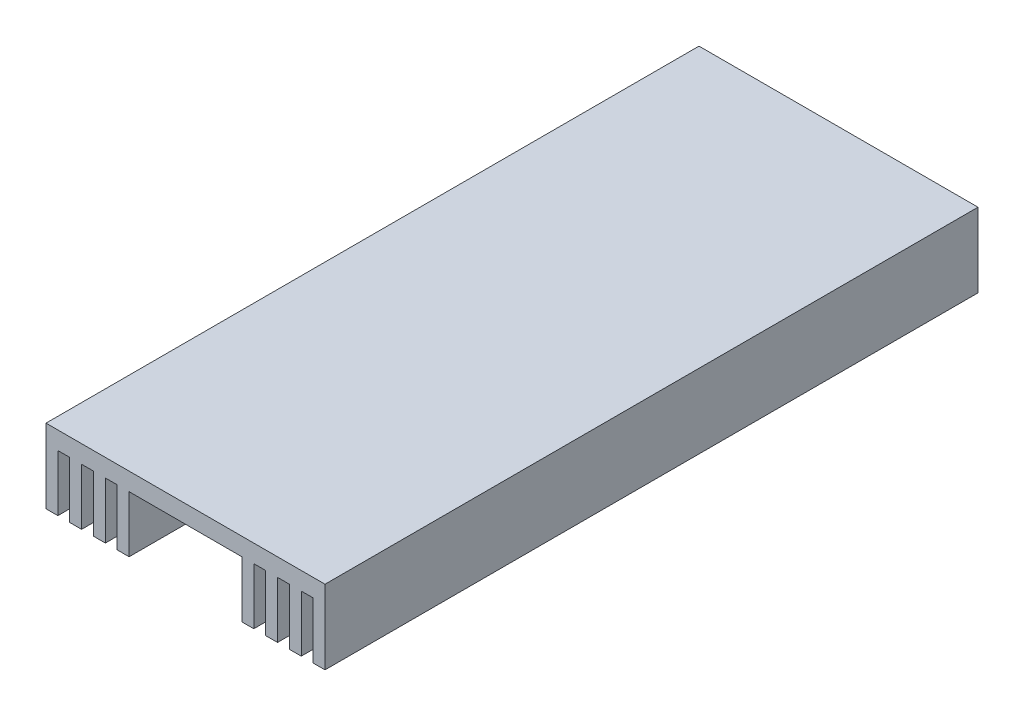
ISO-10303-21;
HEADER;
FILE_DESCRIPTION(('STEP AP214'),'2;1');
FILE_NAME('part.step','',(''),(''),'','','');
FILE_SCHEMA(('AUTOMOTIVE_DESIGN { 1 0 10303 214 1 1 1 1 }'));
ENDSEC;
DATA;
#1=APPLICATION_CONTEXT('core data for automotive mechanical design processes');
#2=APPLICATION_PROTOCOL_DEFINITION('international standard','automotive_design',2000,#1);
#3=PRODUCT_CONTEXT('',#1,'mechanical');
#4=PRODUCT('Part','Part','',(#3));
#5=PRODUCT_RELATED_PRODUCT_CATEGORY('part','',(#4));
#6=PRODUCT_DEFINITION_FORMATION('','',#4);
#7=PRODUCT_DEFINITION_CONTEXT('part definition',#1,'design');
#8=PRODUCT_DEFINITION('design','',#6,#7);
#9=PRODUCT_DEFINITION_SHAPE('','',#8);
#10=(LENGTH_UNIT() NAMED_UNIT(*) SI_UNIT(.MILLI.,.METRE.));
#11=(NAMED_UNIT(*) PLANE_ANGLE_UNIT() SI_UNIT($,.RADIAN.));
#12=(NAMED_UNIT(*) SI_UNIT($,.STERADIAN.) SOLID_ANGLE_UNIT());
#13=UNCERTAINTY_MEASURE_WITH_UNIT(LENGTH_MEASURE(1.E-05),#10,'distance_accuracy_value','');
#14=(GEOMETRIC_REPRESENTATION_CONTEXT(3) GLOBAL_UNCERTAINTY_ASSIGNED_CONTEXT((#13)) GLOBAL_UNIT_ASSIGNED_CONTEXT((#10,
#11,#12)) REPRESENTATION_CONTEXT('',''));
#15=CARTESIAN_POINT('',(0.,0.,0.));
#16=DIRECTION('',(0.,0.,1.));
#17=DIRECTION('',(1.,0.,0.));
#18=AXIS2_PLACEMENT_3D('',#15,#16,#17);
#19=CARTESIAN_POINT('',(0.,9.5,110.));
#20=DIRECTION('',(0.,1.,0.));
#21=DIRECTION('',(0.,0.,1.));
#22=AXIS2_PLACEMENT_3D('',#19,#20,#21);
#23=PLANE('',#22);
#24=DIRECTION('',(1.,0.,0.));
#25=VECTOR('',#24,1.);
#26=CARTESIAN_POINT('',(0.,9.5,0.));
#27=LINE('',#26,#25);
#28=CARTESIAN_POINT('',(14.,9.5,0.));
#29=VERTEX_POINT('',#28);
#30=CARTESIAN_POINT('',(33.,9.5,0.));
#31=VERTEX_POINT('',#30);
#32=EDGE_CURVE('E273',#29,#31,#27,.T.);
#33=ORIENTED_EDGE('',*,*,#32,.T.);
#34=DIRECTION('',(0.,0.,-1.));
#35=VECTOR('',#34,1.);
#36=CARTESIAN_POINT('',(33.,9.5,110.));
#37=LINE('',#36,#35);
#38=CARTESIAN_POINT('',(33.,9.5,110.));
#39=VERTEX_POINT('',#38);
#40=EDGE_CURVE('E11',#39,#31,#37,.T.);
#41=ORIENTED_EDGE('',*,*,#40,.F.);
#42=DIRECTION('',(1.,0.,0.));
#43=VECTOR('',#42,1.);
#44=CARTESIAN_POINT('',(0.,9.5,110.));
#45=LINE('',#44,#43);
#46=CARTESIAN_POINT('',(14.,9.5,110.));
#47=VERTEX_POINT('',#46);
#48=EDGE_CURVE('E162',#47,#39,#45,.T.);
#49=ORIENTED_EDGE('',*,*,#48,.F.);
#50=DIRECTION('',(0.,0.,-1.));
#51=VECTOR('',#50,1.);
#52=CARTESIAN_POINT('',(14.,9.5,110.));
#53=LINE('',#52,#51);
#54=EDGE_CURVE('E269',#47,#29,#53,.T.);
#55=ORIENTED_EDGE('',*,*,#54,.T.);
#56=EDGE_LOOP('',(#33,#41,#49,#55));
#57=FACE_BOUND('',#56,.T.);
#58=ADVANCED_FACE('F34',(#57),#23,.F.);
#59=CARTESIAN_POINT('',(33.,0.,110.));
#60=DIRECTION('',(-1.,0.,0.));
#61=DIRECTION('',(0.,-1.,0.));
#62=AXIS2_PLACEMENT_3D('',#59,#60,#61);
#63=PLANE('',#62);
#64=DIRECTION('',(0.,1.,0.));
#65=VECTOR('',#64,1.);
#66=CARTESIAN_POINT('',(33.,0.,0.));
#67=LINE('',#66,#65);
#68=CARTESIAN_POINT('',(33.,0.,0.));
#69=VERTEX_POINT('',#68);
#70=EDGE_CURVE('E276',#69,#31,#67,.T.);
#71=ORIENTED_EDGE('',*,*,#70,.F.);
#72=DIRECTION('',(0.,0.,-1.));
#73=VECTOR('',#72,1.);
#74=CARTESIAN_POINT('',(33.,0.,110.));
#75=LINE('',#74,#73);
#76=CARTESIAN_POINT('',(33.,0.,110.));
#77=VERTEX_POINT('',#76);
#78=EDGE_CURVE('E42',#77,#69,#75,.T.);
#79=ORIENTED_EDGE('',*,*,#78,.F.);
#80=DIRECTION('',(0.,1.,0.));
#81=VECTOR('',#80,1.);
#82=CARTESIAN_POINT('',(33.,0.,110.));
#83=LINE('',#82,#81);
#84=EDGE_CURVE('E438',#77,#39,#83,.T.);
#85=ORIENTED_EDGE('',*,*,#84,.T.);
#86=ORIENTED_EDGE('',*,*,#40,.T.);
#87=EDGE_LOOP('',(#71,#79,#85,#86));
#88=FACE_BOUND('',#87,.T.);
#89=ADVANCED_FACE('F425',(#88),#63,.T.);
#90=CARTESIAN_POINT('',(0.,0.,110.));
#91=DIRECTION('',(0.,-1.,0.));
#92=DIRECTION('',(0.,0.,-1.));
#93=AXIS2_PLACEMENT_3D('',#90,#91,#92);
#94=PLANE('',#93);
#95=DIRECTION('',(-1.,0.,0.));
#96=VECTOR('',#95,1.);
#97=CARTESIAN_POINT('',(0.,0.,0.));
#98=LINE('',#97,#96);
#99=CARTESIAN_POINT('',(35.,0.,0.));
#100=VERTEX_POINT('',#99);
#101=EDGE_CURVE('E279',#100,#69,#98,.T.);
#102=ORIENTED_EDGE('',*,*,#101,.F.);
#103=DIRECTION('',(0.,0.,-1.));
#104=VECTOR('',#103,1.);
#105=CARTESIAN_POINT('',(35.,0.,110.));
#106=LINE('',#105,#104);
#107=CARTESIAN_POINT('',(35.,0.,110.));
#108=VERTEX_POINT('',#107);
#109=EDGE_CURVE('E415',#108,#100,#106,.T.);
#110=ORIENTED_EDGE('',*,*,#109,.F.);
#111=DIRECTION('',(-1.,0.,0.));
#112=VECTOR('',#111,1.);
#113=CARTESIAN_POINT('',(0.,0.,110.));
#114=LINE('',#113,#112);
#115=EDGE_CURVE('E422',#108,#77,#114,.T.);
#116=ORIENTED_EDGE('',*,*,#115,.T.);
#117=ORIENTED_EDGE('',*,*,#78,.T.);
#118=EDGE_LOOP('',(#102,#110,#116,#117));
#119=FACE_BOUND('',#118,.T.);
#120=ADVANCED_FACE('F420',(#119),#94,.T.);
#121=CARTESIAN_POINT('',(35.,0.,110.));
#122=DIRECTION('',(1.,0.,0.));
#123=DIRECTION('',(0.,0.,-1.));
#124=AXIS2_PLACEMENT_3D('',#121,#122,#123);
#125=PLANE('',#124);
#126=DIRECTION('',(0.,-1.,0.));
#127=VECTOR('',#126,1.);
#128=CARTESIAN_POINT('',(35.,0.,0.));
#129=LINE('',#128,#127);
#130=CARTESIAN_POINT('',(35.,9.5,0.));
#131=VERTEX_POINT('',#130);
#132=EDGE_CURVE('E282',#131,#100,#129,.T.);
#133=ORIENTED_EDGE('',*,*,#132,.F.);
#134=DIRECTION('',(0.,0.,-1.));
#135=VECTOR('',#134,1.);
#136=CARTESIAN_POINT('',(35.,9.5,110.));
#137=LINE('',#136,#135);
#138=CARTESIAN_POINT('',(35.,9.5,110.));
#139=VERTEX_POINT('',#138);
#140=EDGE_CURVE('E413',#139,#131,#137,.T.);
#141=ORIENTED_EDGE('',*,*,#140,.F.);
#142=DIRECTION('',(0.,-1.,0.));
#143=VECTOR('',#142,1.);
#144=CARTESIAN_POINT('',(35.,0.,110.));
#145=LINE('',#144,#143);
#146=EDGE_CURVE('E435',#139,#108,#145,.T.);
#147=ORIENTED_EDGE('',*,*,#146,.T.);
#148=ORIENTED_EDGE('',*,*,#109,.T.);
#149=EDGE_LOOP('',(#133,#141,#147,#148));
#150=FACE_BOUND('',#149,.T.);
#151=ADVANCED_FACE('F432',(#150),#125,.T.);
#152=CARTESIAN_POINT('',(0.,9.5,110.));
#153=DIRECTION('',(0.,-1.,0.));
#154=DIRECTION('',(0.,0.,-1.));
#155=AXIS2_PLACEMENT_3D('',#152,#153,#154);
#156=PLANE('',#155);
#157=DIRECTION('',(-1.,0.,0.));
#158=VECTOR('',#157,1.);
#159=CARTESIAN_POINT('',(0.,9.5,0.));
#160=LINE('',#159,#158);
#161=CARTESIAN_POINT('',(37.,9.5,0.));
#162=VERTEX_POINT('',#161);
#163=EDGE_CURVE('E285',#162,#131,#160,.T.);
#164=ORIENTED_EDGE('',*,*,#163,.F.);
#165=DIRECTION('',(0.,0.,-1.));
#166=VECTOR('',#165,1.);
#167=CARTESIAN_POINT('',(37.,9.5,110.));
#168=LINE('',#167,#166);
#169=CARTESIAN_POINT('',(37.,9.5,110.));
#170=VERTEX_POINT('',#169);
#171=EDGE_CURVE('E411',#170,#162,#168,.T.);
#172=ORIENTED_EDGE('',*,*,#171,.F.);
#173=DIRECTION('',(-1.,0.,0.));
#174=VECTOR('',#173,1.);
#175=CARTESIAN_POINT('',(0.,9.5,110.));
#176=LINE('',#175,#174);
#177=EDGE_CURVE('E440',#170,#139,#176,.T.);
#178=ORIENTED_EDGE('',*,*,#177,.T.);
#179=ORIENTED_EDGE('',*,*,#140,.T.);
#180=EDGE_LOOP('',(#164,#172,#178,#179));
#181=FACE_BOUND('',#180,.T.);
#182=ADVANCED_FACE('F536',(#181),#156,.T.);
#183=CARTESIAN_POINT('',(37.,0.,110.));
#184=DIRECTION('',(-1.,0.,0.));
#185=DIRECTION('',(0.,0.,1.));
#186=AXIS2_PLACEMENT_3D('',#183,#184,#185);
#187=PLANE('',#186);
#188=DIRECTION('',(0.,1.,0.));
#189=VECTOR('',#188,1.);
#190=CARTESIAN_POINT('',(37.,0.,0.));
#191=LINE('',#190,#189);
#192=CARTESIAN_POINT('',(37.,0.,0.));
#193=VERTEX_POINT('',#192);
#194=EDGE_CURVE('E288',#193,#162,#191,.T.);
#195=ORIENTED_EDGE('',*,*,#194,.F.);
#196=DIRECTION('',(0.,0.,-1.));
#197=VECTOR('',#196,1.);
#198=CARTESIAN_POINT('',(37.,0.,110.));
#199=LINE('',#198,#197);
#200=CARTESIAN_POINT('',(37.,0.,110.));
#201=VERTEX_POINT('',#200);
#202=EDGE_CURVE('E409',#201,#193,#199,.T.);
#203=ORIENTED_EDGE('',*,*,#202,.F.);
#204=DIRECTION('',(0.,1.,0.));
#205=VECTOR('',#204,1.);
#206=CARTESIAN_POINT('',(37.,0.,110.));
#207=LINE('',#206,#205);
#208=EDGE_CURVE('E446',#201,#170,#207,.T.);
#209=ORIENTED_EDGE('',*,*,#208,.T.);
#210=ORIENTED_EDGE('',*,*,#171,.T.);
#211=EDGE_LOOP('',(#195,#203,#209,#210));
#212=FACE_BOUND('',#211,.T.);
#213=ADVANCED_FACE('F539',(#212),#187,.T.);
#214=CARTESIAN_POINT('',(0.,0.,110.));
#215=DIRECTION('',(0.,-1.,0.));
#216=DIRECTION('',(0.,0.,-1.));
#217=AXIS2_PLACEMENT_3D('',#214,#215,#216);
#218=PLANE('',#217);
#219=DIRECTION('',(-1.,0.,0.));
#220=VECTOR('',#219,1.);
#221=CARTESIAN_POINT('',(0.,0.,0.));
#222=LINE('',#221,#220);
#223=CARTESIAN_POINT('',(39.,0.,0.));
#224=VERTEX_POINT('',#223);
#225=EDGE_CURVE('E291',#224,#193,#222,.T.);
#226=ORIENTED_EDGE('',*,*,#225,.F.);
#227=DIRECTION('',(0.,0.,-1.));
#228=VECTOR('',#227,1.);
#229=CARTESIAN_POINT('',(39.,0.,110.));
#230=LINE('',#229,#228);
#231=CARTESIAN_POINT('',(39.,0.,110.));
#232=VERTEX_POINT('',#231);
#233=EDGE_CURVE('E407',#232,#224,#230,.T.);
#234=ORIENTED_EDGE('',*,*,#233,.F.);
#235=DIRECTION('',(-1.,0.,0.));
#236=VECTOR('',#235,1.);
#237=CARTESIAN_POINT('',(0.,0.,110.));
#238=LINE('',#237,#236);
#239=EDGE_CURVE('E449',#232,#201,#238,.T.);
#240=ORIENTED_EDGE('',*,*,#239,.T.);
#241=ORIENTED_EDGE('',*,*,#202,.T.);
#242=EDGE_LOOP('',(#226,#234,#240,#241));
#243=FACE_BOUND('',#242,.T.);
#244=ADVANCED_FACE('F543',(#243),#218,.T.);
#245=CARTESIAN_POINT('',(39.,0.,110.));
#246=DIRECTION('',(1.,0.,0.));
#247=DIRECTION('',(0.,0.,-1.));
#248=AXIS2_PLACEMENT_3D('',#245,#246,#247);
#249=PLANE('',#248);
#250=DIRECTION('',(0.,-1.,0.));
#251=VECTOR('',#250,1.);
#252=CARTESIAN_POINT('',(39.,0.,0.));
#253=LINE('',#252,#251);
#254=CARTESIAN_POINT('',(39.,9.5,0.));
#255=VERTEX_POINT('',#254);
#256=EDGE_CURVE('E294',#255,#224,#253,.T.);
#257=ORIENTED_EDGE('',*,*,#256,.F.);
#258=DIRECTION('',(0.,0.,-1.));
#259=VECTOR('',#258,1.);
#260=CARTESIAN_POINT('',(39.,9.5,110.));
#261=LINE('',#260,#259);
#262=CARTESIAN_POINT('',(39.,9.5,110.));
#263=VERTEX_POINT('',#262);
#264=EDGE_CURVE('E405',#263,#255,#261,.T.);
#265=ORIENTED_EDGE('',*,*,#264,.F.);
#266=DIRECTION('',(0.,-1.,0.));
#267=VECTOR('',#266,1.);
#268=CARTESIAN_POINT('',(39.,0.,110.));
#269=LINE('',#268,#267);
#270=EDGE_CURVE('E452',#263,#232,#269,.T.);
#271=ORIENTED_EDGE('',*,*,#270,.T.);
#272=ORIENTED_EDGE('',*,*,#233,.T.);
#273=EDGE_LOOP('',(#257,#265,#271,#272));
#274=FACE_BOUND('',#273,.T.);
#275=ADVANCED_FACE('F547',(#274),#249,.T.);
#276=CARTESIAN_POINT('',(0.,9.5,110.));
#277=DIRECTION('',(0.,-1.,0.));
#278=DIRECTION('',(0.,0.,-1.));
#279=AXIS2_PLACEMENT_3D('',#276,#277,#278);
#280=PLANE('',#279);
#281=DIRECTION('',(-1.,0.,0.));
#282=VECTOR('',#281,1.);
#283=CARTESIAN_POINT('',(0.,9.5,0.));
#284=LINE('',#283,#282);
#285=CARTESIAN_POINT('',(41.,9.5,0.));
#286=VERTEX_POINT('',#285);
#287=EDGE_CURVE('E297',#286,#255,#284,.T.);
#288=ORIENTED_EDGE('',*,*,#287,.F.);
#289=DIRECTION('',(0.,0.,-1.));
#290=VECTOR('',#289,1.);
#291=CARTESIAN_POINT('',(41.,9.5,110.));
#292=LINE('',#291,#290);
#293=CARTESIAN_POINT('',(41.,9.5,110.));
#294=VERTEX_POINT('',#293);
#295=EDGE_CURVE('E403',#294,#286,#292,.T.);
#296=ORIENTED_EDGE('',*,*,#295,.F.);
#297=DIRECTION('',(-1.,0.,0.));
#298=VECTOR('',#297,1.);
#299=CARTESIAN_POINT('',(0.,9.5,110.));
#300=LINE('',#299,#298);
#301=EDGE_CURVE('E455',#294,#263,#300,.T.);
#302=ORIENTED_EDGE('',*,*,#301,.T.);
#303=ORIENTED_EDGE('',*,*,#264,.T.);
#304=EDGE_LOOP('',(#288,#296,#302,#303));
#305=FACE_BOUND('',#304,.T.);
#306=ADVANCED_FACE('F551',(#305),#280,.T.);
#307=CARTESIAN_POINT('',(41.,0.,110.));
#308=DIRECTION('',(-1.,0.,0.));
#309=DIRECTION('',(0.,0.,1.));
#310=AXIS2_PLACEMENT_3D('',#307,#308,#309);
#311=PLANE('',#310);
#312=DIRECTION('',(0.,1.,0.));
#313=VECTOR('',#312,1.);
#314=CARTESIAN_POINT('',(41.,0.,0.));
#315=LINE('',#314,#313);
#316=CARTESIAN_POINT('',(41.,0.,0.));
#317=VERTEX_POINT('',#316);
#318=EDGE_CURVE('E300',#317,#286,#315,.T.);
#319=ORIENTED_EDGE('',*,*,#318,.F.);
#320=DIRECTION('',(0.,0.,-1.));
#321=VECTOR('',#320,1.);
#322=CARTESIAN_POINT('',(41.,0.,110.));
#323=LINE('',#322,#321);
#324=CARTESIAN_POINT('',(41.,0.,110.));
#325=VERTEX_POINT('',#324);
#326=EDGE_CURVE('E401',#325,#317,#323,.T.);
#327=ORIENTED_EDGE('',*,*,#326,.F.);
#328=DIRECTION('',(0.,1.,0.));
#329=VECTOR('',#328,1.);
#330=CARTESIAN_POINT('',(41.,0.,110.));
#331=LINE('',#330,#329);
#332=EDGE_CURVE('E458',#325,#294,#331,.T.);
#333=ORIENTED_EDGE('',*,*,#332,.T.);
#334=ORIENTED_EDGE('',*,*,#295,.T.);
#335=EDGE_LOOP('',(#319,#327,#333,#334));
#336=FACE_BOUND('',#335,.T.);
#337=ADVANCED_FACE('F555',(#336),#311,.T.);
#338=CARTESIAN_POINT('',(0.,0.,110.));
#339=DIRECTION('',(0.,-1.,0.));
#340=DIRECTION('',(0.,0.,-1.));
#341=AXIS2_PLACEMENT_3D('',#338,#339,#340);
#342=PLANE('',#341);
#343=DIRECTION('',(-1.,0.,0.));
#344=VECTOR('',#343,1.);
#345=CARTESIAN_POINT('',(0.,0.,0.));
#346=LINE('',#345,#344);
#347=CARTESIAN_POINT('',(43.,0.,0.));
#348=VERTEX_POINT('',#347);
#349=EDGE_CURVE('E303',#348,#317,#346,.T.);
#350=ORIENTED_EDGE('',*,*,#349,.F.);
#351=DIRECTION('',(0.,0.,-1.));
#352=VECTOR('',#351,1.);
#353=CARTESIAN_POINT('',(43.,0.,110.));
#354=LINE('',#353,#352);
#355=CARTESIAN_POINT('',(43.,0.,110.));
#356=VERTEX_POINT('',#355);
#357=EDGE_CURVE('E399',#356,#348,#354,.T.);
#358=ORIENTED_EDGE('',*,*,#357,.F.);
#359=DIRECTION('',(-1.,0.,0.));
#360=VECTOR('',#359,1.);
#361=CARTESIAN_POINT('',(0.,0.,110.));
#362=LINE('',#361,#360);
#363=EDGE_CURVE('E461',#356,#325,#362,.T.);
#364=ORIENTED_EDGE('',*,*,#363,.T.);
#365=ORIENTED_EDGE('',*,*,#326,.T.);
#366=EDGE_LOOP('',(#350,#358,#364,#365));
#367=FACE_BOUND('',#366,.T.);
#368=ADVANCED_FACE('F559',(#367),#342,.T.);
#369=CARTESIAN_POINT('',(43.,0.,110.));
#370=DIRECTION('',(1.,0.,0.));
#371=DIRECTION('',(0.,1.,0.));
#372=AXIS2_PLACEMENT_3D('',#369,#370,#371);
#373=PLANE('',#372);
#374=DIRECTION('',(0.,-1.,0.));
#375=VECTOR('',#374,1.);
#376=CARTESIAN_POINT('',(43.,0.,0.));
#377=LINE('',#376,#375);
#378=CARTESIAN_POINT('',(43.,9.5,0.));
#379=VERTEX_POINT('',#378);
#380=EDGE_CURVE('E306',#379,#348,#377,.T.);
#381=ORIENTED_EDGE('',*,*,#380,.F.);
#382=DIRECTION('',(0.,0.,-1.));
#383=VECTOR('',#382,1.);
#384=CARTESIAN_POINT('',(43.,9.5,110.));
#385=LINE('',#384,#383);
#386=CARTESIAN_POINT('',(43.,9.5,110.));
#387=VERTEX_POINT('',#386);
#388=EDGE_CURVE('E397',#387,#379,#385,.T.);
#389=ORIENTED_EDGE('',*,*,#388,.F.);
#390=DIRECTION('',(0.,-1.,0.));
#391=VECTOR('',#390,1.);
#392=CARTESIAN_POINT('',(43.,0.,110.));
#393=LINE('',#392,#391);
#394=EDGE_CURVE('E464',#387,#356,#393,.T.);
#395=ORIENTED_EDGE('',*,*,#394,.T.);
#396=ORIENTED_EDGE('',*,*,#357,.T.);
#397=EDGE_LOOP('',(#381,#389,#395,#396));
#398=FACE_BOUND('',#397,.T.);
#399=ADVANCED_FACE('F563',(#398),#373,.T.);
#400=CARTESIAN_POINT('',(0.,9.5,110.));
#401=DIRECTION('',(0.,-1.,0.));
#402=DIRECTION('',(0.,0.,-1.));
#403=AXIS2_PLACEMENT_3D('',#400,#401,#402);
#404=PLANE('',#403);
#405=DIRECTION('',(-1.,0.,0.));
#406=VECTOR('',#405,1.);
#407=CARTESIAN_POINT('',(0.,9.5,0.));
#408=LINE('',#407,#406);
#409=CARTESIAN_POINT('',(45.,9.5,0.));
#410=VERTEX_POINT('',#409);
#411=EDGE_CURVE('E309',#410,#379,#408,.T.);
#412=ORIENTED_EDGE('',*,*,#411,.F.);
#413=DIRECTION('',(0.,0.,-1.));
#414=VECTOR('',#413,1.);
#415=CARTESIAN_POINT('',(45.,9.5,110.));
#416=LINE('',#415,#414);
#417=CARTESIAN_POINT('',(45.,9.5,110.));
#418=VERTEX_POINT('',#417);
#419=EDGE_CURVE('E395',#418,#410,#416,.T.);
#420=ORIENTED_EDGE('',*,*,#419,.F.);
#421=DIRECTION('',(-1.,0.,0.));
#422=VECTOR('',#421,1.);
#423=CARTESIAN_POINT('',(0.,9.5,110.));
#424=LINE('',#423,#422);
#425=EDGE_CURVE('E467',#418,#387,#424,.T.);
#426=ORIENTED_EDGE('',*,*,#425,.T.);
#427=ORIENTED_EDGE('',*,*,#388,.T.);
#428=EDGE_LOOP('',(#412,#420,#426,#427));
#429=FACE_BOUND('',#428,.T.);
#430=ADVANCED_FACE('F567',(#429),#404,.T.);
#431=CARTESIAN_POINT('',(45.,0.,110.));
#432=DIRECTION('',(-1.,0.,0.));
#433=DIRECTION('',(0.,0.,1.));
#434=AXIS2_PLACEMENT_3D('',#431,#432,#433);
#435=PLANE('',#434);
#436=DIRECTION('',(0.,1.,0.));
#437=VECTOR('',#436,1.);
#438=CARTESIAN_POINT('',(45.,0.,0.));
#439=LINE('',#438,#437);
#440=CARTESIAN_POINT('',(45.,0.,0.));
#441=VERTEX_POINT('',#440);
#442=EDGE_CURVE('E312',#441,#410,#439,.T.);
#443=ORIENTED_EDGE('',*,*,#442,.F.);
#444=DIRECTION('',(0.,0.,-1.));
#445=VECTOR('',#444,1.);
#446=CARTESIAN_POINT('',(45.,0.,110.));
#447=LINE('',#446,#445);
#448=CARTESIAN_POINT('',(45.,0.,110.));
#449=VERTEX_POINT('',#448);
#450=EDGE_CURVE('E393',#449,#441,#447,.T.);
#451=ORIENTED_EDGE('',*,*,#450,.F.);
#452=DIRECTION('',(0.,1.,0.));
#453=VECTOR('',#452,1.);
#454=CARTESIAN_POINT('',(45.,0.,110.));
#455=LINE('',#454,#453);
#456=EDGE_CURVE('E470',#449,#418,#455,.T.);
#457=ORIENTED_EDGE('',*,*,#456,.T.);
#458=ORIENTED_EDGE('',*,*,#419,.T.);
#459=EDGE_LOOP('',(#443,#451,#457,#458));
#460=FACE_BOUND('',#459,.T.);
#461=ADVANCED_FACE('F571',(#460),#435,.T.);
#462=CARTESIAN_POINT('',(0.,0.,110.));
#463=DIRECTION('',(0.,-1.,0.));
#464=DIRECTION('',(1.,0.,0.));
#465=AXIS2_PLACEMENT_3D('',#462,#463,#464);
#466=PLANE('',#465);
#467=DIRECTION('',(-1.,0.,0.));
#468=VECTOR('',#467,1.);
#469=CARTESIAN_POINT('',(0.,0.,0.));
#470=LINE('',#469,#468);
#471=CARTESIAN_POINT('',(47.,0.,0.));
#472=VERTEX_POINT('',#471);
#473=EDGE_CURVE('E315',#472,#441,#470,.T.);
#474=ORIENTED_EDGE('',*,*,#473,.F.);
#475=DIRECTION('',(0.,0.,-1.));
#476=VECTOR('',#475,1.);
#477=CARTESIAN_POINT('',(47.,0.,110.));
#478=LINE('',#477,#476);
#479=CARTESIAN_POINT('',(47.,0.,110.));
#480=VERTEX_POINT('',#479);
#481=EDGE_CURVE('E391',#480,#472,#478,.T.);
#482=ORIENTED_EDGE('',*,*,#481,.F.);
#483=DIRECTION('',(-1.,0.,0.));
#484=VECTOR('',#483,1.);
#485=CARTESIAN_POINT('',(0.,0.,110.));
#486=LINE('',#485,#484);
#487=EDGE_CURVE('E473',#480,#449,#486,.T.);
#488=ORIENTED_EDGE('',*,*,#487,.T.);
#489=ORIENTED_EDGE('',*,*,#450,.T.);
#490=EDGE_LOOP('',(#474,#482,#488,#489));
#491=FACE_BOUND('',#490,.T.);
#492=ADVANCED_FACE('F575',(#491),#466,.T.);
#493=CARTESIAN_POINT('',(47.,0.,110.));
#494=DIRECTION('',(1.,0.,0.));
#495=DIRECTION('',(0.,0.,-1.));
#496=AXIS2_PLACEMENT_3D('',#493,#494,#495);
#497=PLANE('',#496);
#498=DIRECTION('',(0.,-1.,0.));
#499=VECTOR('',#498,1.);
#500=CARTESIAN_POINT('',(47.,0.,0.));
#501=LINE('',#500,#499);
#502=CARTESIAN_POINT('',(47.,12.5,0.));
#503=VERTEX_POINT('',#502);
#504=EDGE_CURVE('E318',#503,#472,#501,.T.);
#505=ORIENTED_EDGE('',*,*,#504,.F.);
#506=DIRECTION('',(0.,0.,-1.));
#507=VECTOR('',#506,1.);
#508=CARTESIAN_POINT('',(47.,12.5,110.));
#509=LINE('',#508,#507);
#510=CARTESIAN_POINT('',(47.,12.5,110.));
#511=VERTEX_POINT('',#510);
#512=EDGE_CURVE('E389',#511,#503,#509,.T.);
#513=ORIENTED_EDGE('',*,*,#512,.F.);
#514=DIRECTION('',(0.,-1.,0.));
#515=VECTOR('',#514,1.);
#516=CARTESIAN_POINT('',(47.,0.,110.));
#517=LINE('',#516,#515);
#518=EDGE_CURVE('E476',#511,#480,#517,.T.);
#519=ORIENTED_EDGE('',*,*,#518,.T.);
#520=ORIENTED_EDGE('',*,*,#481,.T.);
#521=EDGE_LOOP('',(#505,#513,#519,#520));
#522=FACE_BOUND('',#521,.T.);
#523=ADVANCED_FACE('F579',(#522),#497,.T.);
#524=CARTESIAN_POINT('',(0.,12.5,110.));
#525=DIRECTION('',(0.,1.,0.));
#526=DIRECTION('',(0.,0.,1.));
#527=AXIS2_PLACEMENT_3D('',#524,#525,#526);
#528=PLANE('',#527);
#529=DIRECTION('',(1.,0.,0.));
#530=VECTOR('',#529,1.);
#531=CARTESIAN_POINT('',(0.,12.5,0.));
#532=LINE('',#531,#530);
#533=CARTESIAN_POINT('',(0.,12.5,0.));
#534=VERTEX_POINT('',#533);
#535=EDGE_CURVE('E321',#534,#503,#532,.T.);
#536=ORIENTED_EDGE('',*,*,#535,.F.);
#537=DIRECTION('',(0.,0.,-1.));
#538=VECTOR('',#537,1.);
#539=CARTESIAN_POINT('',(0.,12.5,110.));
#540=LINE('',#539,#538);
#541=CARTESIAN_POINT('',(0.,12.5,110.));
#542=VERTEX_POINT('',#541);
#543=EDGE_CURVE('E387',#542,#534,#540,.T.);
#544=ORIENTED_EDGE('',*,*,#543,.F.);
#545=DIRECTION('',(1.,0.,0.));
#546=VECTOR('',#545,1.);
#547=CARTESIAN_POINT('',(0.,12.5,110.));
#548=LINE('',#547,#546);
#549=EDGE_CURVE('E479',#542,#511,#548,.T.);
#550=ORIENTED_EDGE('',*,*,#549,.T.);
#551=ORIENTED_EDGE('',*,*,#512,.T.);
#552=EDGE_LOOP('',(#536,#544,#550,#551));
#553=FACE_BOUND('',#552,.T.);
#554=ADVANCED_FACE('F583',(#553),#528,.T.);
#555=CARTESIAN_POINT('',(0.,0.,110.));
#556=DIRECTION('',(-1.,0.,0.));
#557=DIRECTION('',(0.,0.,1.));
#558=AXIS2_PLACEMENT_3D('',#555,#556,#557);
#559=PLANE('',#558);
#560=DIRECTION('',(0.,1.,0.));
#561=VECTOR('',#560,1.);
#562=CARTESIAN_POINT('',(0.,0.,0.));
#563=LINE('',#562,#561);
#564=CARTESIAN_POINT('',(0.,0.,0.));
#565=VERTEX_POINT('',#564);
#566=EDGE_CURVE('E324',#565,#534,#563,.T.);
#567=ORIENTED_EDGE('',*,*,#566,.F.);
#568=DIRECTION('',(0.,0.,-1.));
#569=VECTOR('',#568,1.);
#570=CARTESIAN_POINT('',(0.,0.,110.));
#571=LINE('',#570,#569);
#572=CARTESIAN_POINT('',(0.,0.,110.));
#573=VERTEX_POINT('',#572);
#574=EDGE_CURVE('E385',#573,#565,#571,.T.);
#575=ORIENTED_EDGE('',*,*,#574,.F.);
#576=DIRECTION('',(0.,1.,0.));
#577=VECTOR('',#576,1.);
#578=CARTESIAN_POINT('',(0.,0.,110.));
#579=LINE('',#578,#577);
#580=EDGE_CURVE('E482',#573,#542,#579,.T.);
#581=ORIENTED_EDGE('',*,*,#580,.T.);
#582=ORIENTED_EDGE('',*,*,#543,.T.);
#583=EDGE_LOOP('',(#567,#575,#581,#582));
#584=FACE_BOUND('',#583,.T.);
#585=ADVANCED_FACE('F587',(#584),#559,.T.);
#586=CARTESIAN_POINT('',(0.,0.,110.));
#587=DIRECTION('',(0.,1.,0.));
#588=DIRECTION('',(0.,0.,1.));
#589=AXIS2_PLACEMENT_3D('',#586,#587,#588);
#590=PLANE('',#589);
#591=DIRECTION('',(1.,0.,0.));
#592=VECTOR('',#591,1.);
#593=CARTESIAN_POINT('',(0.,0.,0.));
#594=LINE('',#593,#592);
#595=CARTESIAN_POINT('',(2.,0.,0.));
#596=VERTEX_POINT('',#595);
#597=EDGE_CURVE('E327',#565,#596,#594,.T.);
#598=ORIENTED_EDGE('',*,*,#597,.T.);
#599=DIRECTION('',(0.,0.,-1.));
#600=VECTOR('',#599,1.);
#601=CARTESIAN_POINT('',(2.,0.,110.));
#602=LINE('',#601,#600);
#603=CARTESIAN_POINT('',(2.,0.,110.));
#604=VERTEX_POINT('',#603);
#605=EDGE_CURVE('E382',#604,#596,#602,.T.);
#606=ORIENTED_EDGE('',*,*,#605,.F.);
#607=DIRECTION('',(1.,0.,0.));
#608=VECTOR('',#607,1.);
#609=CARTESIAN_POINT('',(0.,0.,110.));
#610=LINE('',#609,#608);
#611=EDGE_CURVE('E485',#573,#604,#610,.T.);
#612=ORIENTED_EDGE('',*,*,#611,.F.);
#613=ORIENTED_EDGE('',*,*,#574,.T.);
#614=EDGE_LOOP('',(#598,#606,#612,#613));
#615=FACE_BOUND('',#614,.T.);
#616=ADVANCED_FACE('F591',(#615),#590,.F.);
#617=CARTESIAN_POINT('',(2.,0.,110.));
#618=DIRECTION('',(-1.,0.,0.));
#619=DIRECTION('',(0.,0.,1.));
#620=AXIS2_PLACEMENT_3D('',#617,#618,#619);
#621=PLANE('',#620);
#622=DIRECTION('',(0.,1.,0.));
#623=VECTOR('',#622,1.);
#624=CARTESIAN_POINT('',(2.,0.,0.));
#625=LINE('',#624,#623);
#626=CARTESIAN_POINT('',(2.,9.5,0.));
#627=VERTEX_POINT('',#626);
#628=EDGE_CURVE('E329',#596,#627,#625,.T.);
#629=ORIENTED_EDGE('',*,*,#628,.T.);
#630=DIRECTION('',(0.,0.,-1.));
#631=VECTOR('',#630,1.);
#632=CARTESIAN_POINT('',(2.,9.5,110.));
#633=LINE('',#632,#631);
#634=CARTESIAN_POINT('',(2.,9.5,110.));
#635=VERTEX_POINT('',#634);
#636=EDGE_CURVE('E379',#635,#627,#633,.T.);
#637=ORIENTED_EDGE('',*,*,#636,.F.);
#638=DIRECTION('',(0.,1.,0.));
#639=VECTOR('',#638,1.);
#640=CARTESIAN_POINT('',(2.,0.,110.));
#641=LINE('',#640,#639);
#642=EDGE_CURVE('E487',#604,#635,#641,.T.);
#643=ORIENTED_EDGE('',*,*,#642,.F.);
#644=ORIENTED_EDGE('',*,*,#605,.T.);
#645=EDGE_LOOP('',(#629,#637,#643,#644));
#646=FACE_BOUND('',#645,.T.);
#647=ADVANCED_FACE('F595',(#646),#621,.F.);
#648=CARTESIAN_POINT('',(0.,9.5,110.));
#649=DIRECTION('',(0.,1.,0.));
#650=DIRECTION('',(0.,0.,1.));
#651=AXIS2_PLACEMENT_3D('',#648,#649,#650);
#652=PLANE('',#651);
#653=DIRECTION('',(1.,0.,0.));
#654=VECTOR('',#653,1.);
#655=CARTESIAN_POINT('',(0.,9.5,0.));
#656=LINE('',#655,#654);
#657=CARTESIAN_POINT('',(4.,9.5,0.));
#658=VERTEX_POINT('',#657);
#659=EDGE_CURVE('E331',#627,#658,#656,.T.);
#660=ORIENTED_EDGE('',*,*,#659,.T.);
#661=DIRECTION('',(0.,0.,-1.));
#662=VECTOR('',#661,1.);
#663=CARTESIAN_POINT('',(4.,9.5,110.));
#664=LINE('',#663,#662);
#665=CARTESIAN_POINT('',(4.,9.5,110.));
#666=VERTEX_POINT('',#665);
#667=EDGE_CURVE('E376',#666,#658,#664,.T.);
#668=ORIENTED_EDGE('',*,*,#667,.F.);
#669=DIRECTION('',(1.,0.,0.));
#670=VECTOR('',#669,1.);
#671=CARTESIAN_POINT('',(0.,9.5,110.));
#672=LINE('',#671,#670);
#673=EDGE_CURVE('E489',#635,#666,#672,.T.);
#674=ORIENTED_EDGE('',*,*,#673,.F.);
#675=ORIENTED_EDGE('',*,*,#636,.T.);
#676=EDGE_LOOP('',(#660,#668,#674,#675));
#677=FACE_BOUND('',#676,.T.);
#678=ADVANCED_FACE('F599',(#677),#652,.F.);
#679=CARTESIAN_POINT('',(4.,0.,110.));
#680=DIRECTION('',(1.,0.,0.));
#681=DIRECTION('',(0.,1.,0.));
#682=AXIS2_PLACEMENT_3D('',#679,#680,#681);
#683=PLANE('',#682);
#684=DIRECTION('',(0.,-1.,0.));
#685=VECTOR('',#684,1.);
#686=CARTESIAN_POINT('',(4.,0.,0.));
#687=LINE('',#686,#685);
#688=CARTESIAN_POINT('',(4.,0.,0.));
#689=VERTEX_POINT('',#688);
#690=EDGE_CURVE('E333',#658,#689,#687,.T.);
#691=ORIENTED_EDGE('',*,*,#690,.T.);
#692=DIRECTION('',(0.,0.,-1.));
#693=VECTOR('',#692,1.);
#694=CARTESIAN_POINT('',(4.,0.,110.));
#695=LINE('',#694,#693);
#696=CARTESIAN_POINT('',(4.,0.,110.));
#697=VERTEX_POINT('',#696);
#698=EDGE_CURVE('E373',#697,#689,#695,.T.);
#699=ORIENTED_EDGE('',*,*,#698,.F.);
#700=DIRECTION('',(0.,-1.,0.));
#701=VECTOR('',#700,1.);
#702=CARTESIAN_POINT('',(4.,0.,110.));
#703=LINE('',#702,#701);
#704=EDGE_CURVE('E491',#666,#697,#703,.T.);
#705=ORIENTED_EDGE('',*,*,#704,.F.);
#706=ORIENTED_EDGE('',*,*,#667,.T.);
#707=EDGE_LOOP('',(#691,#699,#705,#706));
#708=FACE_BOUND('',#707,.T.);
#709=ADVANCED_FACE('F603',(#708),#683,.F.);
#710=CARTESIAN_POINT('',(0.,0.,110.));
#711=DIRECTION('',(0.,1.,0.));
#712=DIRECTION('',(0.,0.,1.));
#713=AXIS2_PLACEMENT_3D('',#710,#711,#712);
#714=PLANE('',#713);
#715=DIRECTION('',(1.,0.,0.));
#716=VECTOR('',#715,1.);
#717=CARTESIAN_POINT('',(0.,0.,0.));
#718=LINE('',#717,#716);
#719=CARTESIAN_POINT('',(6.,0.,0.));
#720=VERTEX_POINT('',#719);
#721=EDGE_CURVE('E335',#689,#720,#718,.T.);
#722=ORIENTED_EDGE('',*,*,#721,.T.);
#723=DIRECTION('',(0.,0.,-1.));
#724=VECTOR('',#723,1.);
#725=CARTESIAN_POINT('',(6.,0.,110.));
#726=LINE('',#725,#724);
#727=CARTESIAN_POINT('',(6.,0.,110.));
#728=VERTEX_POINT('',#727);
#729=EDGE_CURVE('E370',#728,#720,#726,.T.);
#730=ORIENTED_EDGE('',*,*,#729,.F.);
#731=DIRECTION('',(1.,0.,0.));
#732=VECTOR('',#731,1.);
#733=CARTESIAN_POINT('',(0.,0.,110.));
#734=LINE('',#733,#732);
#735=EDGE_CURVE('E493',#697,#728,#734,.T.);
#736=ORIENTED_EDGE('',*,*,#735,.F.);
#737=ORIENTED_EDGE('',*,*,#698,.T.);
#738=EDGE_LOOP('',(#722,#730,#736,#737));
#739=FACE_BOUND('',#738,.T.);
#740=ADVANCED_FACE('F607',(#739),#714,.F.);
#741=CARTESIAN_POINT('',(6.,0.,110.));
#742=DIRECTION('',(-1.,0.,0.));
#743=DIRECTION('',(0.,0.,1.));
#744=AXIS2_PLACEMENT_3D('',#741,#742,#743);
#745=PLANE('',#744);
#746=DIRECTION('',(0.,1.,0.));
#747=VECTOR('',#746,1.);
#748=CARTESIAN_POINT('',(6.,0.,0.));
#749=LINE('',#748,#747);
#750=CARTESIAN_POINT('',(6.,9.5,0.));
#751=VERTEX_POINT('',#750);
#752=EDGE_CURVE('E337',#720,#751,#749,.T.);
#753=ORIENTED_EDGE('',*,*,#752,.T.);
#754=DIRECTION('',(0.,0.,-1.));
#755=VECTOR('',#754,1.);
#756=CARTESIAN_POINT('',(6.,9.5,110.));
#757=LINE('',#756,#755);
#758=CARTESIAN_POINT('',(6.,9.5,110.));
#759=VERTEX_POINT('',#758);
#760=EDGE_CURVE('E367',#759,#751,#757,.T.);
#761=ORIENTED_EDGE('',*,*,#760,.F.);
#762=DIRECTION('',(0.,1.,0.));
#763=VECTOR('',#762,1.);
#764=CARTESIAN_POINT('',(6.,0.,110.));
#765=LINE('',#764,#763);
#766=EDGE_CURVE('E495',#728,#759,#765,.T.);
#767=ORIENTED_EDGE('',*,*,#766,.F.);
#768=ORIENTED_EDGE('',*,*,#729,.T.);
#769=EDGE_LOOP('',(#753,#761,#767,#768));
#770=FACE_BOUND('',#769,.T.);
#771=ADVANCED_FACE('F611',(#770),#745,.F.);
#772=CARTESIAN_POINT('',(0.,9.5,110.));
#773=DIRECTION('',(0.,1.,0.));
#774=DIRECTION('',(0.,0.,1.));
#775=AXIS2_PLACEMENT_3D('',#772,#773,#774);
#776=PLANE('',#775);
#777=DIRECTION('',(1.,0.,0.));
#778=VECTOR('',#777,1.);
#779=CARTESIAN_POINT('',(0.,9.5,0.));
#780=LINE('',#779,#778);
#781=CARTESIAN_POINT('',(8.,9.5,0.));
#782=VERTEX_POINT('',#781);
#783=EDGE_CURVE('E339',#751,#782,#780,.T.);
#784=ORIENTED_EDGE('',*,*,#783,.T.);
#785=DIRECTION('',(0.,0.,-1.));
#786=VECTOR('',#785,1.);
#787=CARTESIAN_POINT('',(8.,9.5,110.));
#788=LINE('',#787,#786);
#789=CARTESIAN_POINT('',(8.,9.5,110.));
#790=VERTEX_POINT('',#789);
#791=EDGE_CURVE('E364',#790,#782,#788,.T.);
#792=ORIENTED_EDGE('',*,*,#791,.F.);
#793=DIRECTION('',(1.,0.,0.));
#794=VECTOR('',#793,1.);
#795=CARTESIAN_POINT('',(0.,9.5,110.));
#796=LINE('',#795,#794);
#797=EDGE_CURVE('E497',#759,#790,#796,.T.);
#798=ORIENTED_EDGE('',*,*,#797,.F.);
#799=ORIENTED_EDGE('',*,*,#760,.T.);
#800=EDGE_LOOP('',(#784,#792,#798,#799));
#801=FACE_BOUND('',#800,.T.);
#802=ADVANCED_FACE('F615',(#801),#776,.F.);
#803=CARTESIAN_POINT('',(8.,0.,110.));
#804=DIRECTION('',(1.,0.,0.));
#805=DIRECTION('',(0.,1.,0.));
#806=AXIS2_PLACEMENT_3D('',#803,#804,#805);
#807=PLANE('',#806);
#808=DIRECTION('',(0.,-1.,0.));
#809=VECTOR('',#808,1.);
#810=CARTESIAN_POINT('',(8.,0.,0.));
#811=LINE('',#810,#809);
#812=CARTESIAN_POINT('',(8.,0.,0.));
#813=VERTEX_POINT('',#812);
#814=EDGE_CURVE('E341',#782,#813,#811,.T.);
#815=ORIENTED_EDGE('',*,*,#814,.T.);
#816=DIRECTION('',(0.,0.,-1.));
#817=VECTOR('',#816,1.);
#818=CARTESIAN_POINT('',(8.,0.,110.));
#819=LINE('',#818,#817);
#820=CARTESIAN_POINT('',(8.,0.,110.));
#821=VERTEX_POINT('',#820);
#822=EDGE_CURVE('E361',#821,#813,#819,.T.);
#823=ORIENTED_EDGE('',*,*,#822,.F.);
#824=DIRECTION('',(0.,-1.,0.));
#825=VECTOR('',#824,1.);
#826=CARTESIAN_POINT('',(8.,0.,110.));
#827=LINE('',#826,#825);
#828=EDGE_CURVE('E499',#790,#821,#827,.T.);
#829=ORIENTED_EDGE('',*,*,#828,.F.);
#830=ORIENTED_EDGE('',*,*,#791,.T.);
#831=EDGE_LOOP('',(#815,#823,#829,#830));
#832=FACE_BOUND('',#831,.T.);
#833=ADVANCED_FACE('F619',(#832),#807,.F.);
#834=CARTESIAN_POINT('',(0.,0.,110.));
#835=DIRECTION('',(0.,1.,0.));
#836=DIRECTION('',(0.,0.,1.));
#837=AXIS2_PLACEMENT_3D('',#834,#835,#836);
#838=PLANE('',#837);
#839=DIRECTION('',(1.,0.,0.));
#840=VECTOR('',#839,1.);
#841=CARTESIAN_POINT('',(0.,0.,0.));
#842=LINE('',#841,#840);
#843=CARTESIAN_POINT('',(10.,0.,0.));
#844=VERTEX_POINT('',#843);
#845=EDGE_CURVE('E343',#813,#844,#842,.T.);
#846=ORIENTED_EDGE('',*,*,#845,.T.);
#847=DIRECTION('',(0.,0.,-1.));
#848=VECTOR('',#847,1.);
#849=CARTESIAN_POINT('',(10.,0.,110.));
#850=LINE('',#849,#848);
#851=CARTESIAN_POINT('',(10.,0.,110.));
#852=VERTEX_POINT('',#851);
#853=EDGE_CURVE('E358',#852,#844,#850,.T.);
#854=ORIENTED_EDGE('',*,*,#853,.F.);
#855=DIRECTION('',(1.,0.,0.));
#856=VECTOR('',#855,1.);
#857=CARTESIAN_POINT('',(0.,0.,110.));
#858=LINE('',#857,#856);
#859=EDGE_CURVE('E501',#821,#852,#858,.T.);
#860=ORIENTED_EDGE('',*,*,#859,.F.);
#861=ORIENTED_EDGE('',*,*,#822,.T.);
#862=EDGE_LOOP('',(#846,#854,#860,#861));
#863=FACE_BOUND('',#862,.T.);
#864=ADVANCED_FACE('F623',(#863),#838,.F.);
#865=CARTESIAN_POINT('',(10.,0.,110.));
#866=DIRECTION('',(-1.,0.,0.));
#867=DIRECTION('',(0.,0.,1.));
#868=AXIS2_PLACEMENT_3D('',#865,#866,#867);
#869=PLANE('',#868);
#870=DIRECTION('',(0.,1.,0.));
#871=VECTOR('',#870,1.);
#872=CARTESIAN_POINT('',(10.,0.,0.));
#873=LINE('',#872,#871);
#874=CARTESIAN_POINT('',(10.,9.5,0.));
#875=VERTEX_POINT('',#874);
#876=EDGE_CURVE('E345',#844,#875,#873,.T.);
#877=ORIENTED_EDGE('',*,*,#876,.T.);
#878=DIRECTION('',(0.,0.,-1.));
#879=VECTOR('',#878,1.);
#880=CARTESIAN_POINT('',(10.,9.5,110.));
#881=LINE('',#880,#879);
#882=CARTESIAN_POINT('',(10.,9.5,110.));
#883=VERTEX_POINT('',#882);
#884=EDGE_CURVE('E355',#883,#875,#881,.T.);
#885=ORIENTED_EDGE('',*,*,#884,.F.);
#886=DIRECTION('',(0.,1.,0.));
#887=VECTOR('',#886,1.);
#888=CARTESIAN_POINT('',(10.,0.,110.));
#889=LINE('',#888,#887);
#890=EDGE_CURVE('E503',#852,#883,#889,.T.);
#891=ORIENTED_EDGE('',*,*,#890,.F.);
#892=ORIENTED_EDGE('',*,*,#853,.T.);
#893=EDGE_LOOP('',(#877,#885,#891,#892));
#894=FACE_BOUND('',#893,.T.);
#895=ADVANCED_FACE('F509',(#894),#869,.F.);
#896=CARTESIAN_POINT('',(0.,9.5,110.));
#897=DIRECTION('',(0.,1.,0.));
#898=DIRECTION('',(0.,0.,1.));
#899=AXIS2_PLACEMENT_3D('',#896,#897,#898);
#900=PLANE('',#899);
#901=DIRECTION('',(1.,0.,0.));
#902=VECTOR('',#901,1.);
#903=CARTESIAN_POINT('',(0.,9.5,0.));
#904=LINE('',#903,#902);
#905=CARTESIAN_POINT('',(12.,9.5,0.));
#906=VERTEX_POINT('',#905);
#907=EDGE_CURVE('E347',#875,#906,#904,.T.);
#908=ORIENTED_EDGE('',*,*,#907,.T.);
#909=DIRECTION('',(0.,0.,-1.));
#910=VECTOR('',#909,1.);
#911=CARTESIAN_POINT('',(12.,9.5,110.));
#912=LINE('',#911,#910);
#913=CARTESIAN_POINT('',(12.,9.5,110.));
#914=VERTEX_POINT('',#913);
#915=EDGE_CURVE('E264',#914,#906,#912,.T.);
#916=ORIENTED_EDGE('',*,*,#915,.F.);
#917=DIRECTION('',(1.,0.,0.));
#918=VECTOR('',#917,1.);
#919=CARTESIAN_POINT('',(0.,9.5,110.));
#920=LINE('',#919,#918);
#921=EDGE_CURVE('E255',#883,#914,#920,.T.);
#922=ORIENTED_EDGE('',*,*,#921,.F.);
#923=ORIENTED_EDGE('',*,*,#884,.T.);
#924=EDGE_LOOP('',(#908,#916,#922,#923));
#925=FACE_BOUND('',#924,.T.);
#926=ADVANCED_FACE('F513',(#925),#900,.F.);
#927=CARTESIAN_POINT('',(12.,0.,110.));
#928=DIRECTION('',(1.,0.,0.));
#929=DIRECTION('',(0.,0.,-1.));
#930=AXIS2_PLACEMENT_3D('',#927,#928,#929);
#931=PLANE('',#930);
#932=DIRECTION('',(0.,-1.,0.));
#933=VECTOR('',#932,1.);
#934=CARTESIAN_POINT('',(12.,0.,0.));
#935=LINE('',#934,#933);
#936=CARTESIAN_POINT('',(12.,0.,0.));
#937=VERTEX_POINT('',#936);
#938=EDGE_CURVE('E263',#906,#937,#935,.T.);
#939=ORIENTED_EDGE('',*,*,#938,.T.);
#940=DIRECTION('',(0.,0.,-1.));
#941=VECTOR('',#940,1.);
#942=CARTESIAN_POINT('',(12.,0.,110.));
#943=LINE('',#942,#941);
#944=CARTESIAN_POINT('',(12.,0.,110.));
#945=VERTEX_POINT('',#944);
#946=EDGE_CURVE('E260',#945,#937,#943,.T.);
#947=ORIENTED_EDGE('',*,*,#946,.F.);
#948=DIRECTION('',(0.,-1.,0.));
#949=VECTOR('',#948,1.);
#950=CARTESIAN_POINT('',(12.,0.,110.));
#951=LINE('',#950,#949);
#952=EDGE_CURVE('E249',#914,#945,#951,.T.);
#953=ORIENTED_EDGE('',*,*,#952,.F.);
#954=ORIENTED_EDGE('',*,*,#915,.T.);
#955=EDGE_LOOP('',(#939,#947,#953,#954));
#956=FACE_BOUND('',#955,.T.);
#957=ADVANCED_FACE('F261',(#956),#931,.F.);
#958=CARTESIAN_POINT('',(0.,0.,110.));
#959=DIRECTION('',(0.,1.,0.));
#960=DIRECTION('',(0.,0.,1.));
#961=AXIS2_PLACEMENT_3D('',#958,#959,#960);
#962=PLANE('',#961);
#963=DIRECTION('',(1.,0.,0.));
#964=VECTOR('',#963,1.);
#965=CARTESIAN_POINT('',(0.,0.,0.));
#966=LINE('',#965,#964);
#967=CARTESIAN_POINT('',(14.,0.,0.));
#968=VERTEX_POINT('',#967);
#969=EDGE_CURVE('E150',#937,#968,#966,.T.);
#970=ORIENTED_EDGE('',*,*,#969,.T.);
#971=DIRECTION('',(0.,0.,-1.));
#972=VECTOR('',#971,1.);
#973=CARTESIAN_POINT('',(14.,0.,110.));
#974=LINE('',#973,#972);
#975=CARTESIAN_POINT('',(14.,0.,110.));
#976=VERTEX_POINT('',#975);
#977=EDGE_CURVE('E265',#976,#968,#974,.T.);
#978=ORIENTED_EDGE('',*,*,#977,.F.);
#979=DIRECTION('',(1.,0.,0.));
#980=VECTOR('',#979,1.);
#981=CARTESIAN_POINT('',(0.,0.,110.));
#982=LINE('',#981,#980);
#983=EDGE_CURVE('E253',#945,#976,#982,.T.);
#984=ORIENTED_EDGE('',*,*,#983,.F.);
#985=ORIENTED_EDGE('',*,*,#946,.T.);
#986=EDGE_LOOP('',(#970,#978,#984,#985));
#987=FACE_BOUND('',#986,.T.);
#988=ADVANCED_FACE('F267',(#987),#962,.F.);
#989=CARTESIAN_POINT('',(14.,0.,110.));
#990=DIRECTION('',(-1.,0.,0.));
#991=DIRECTION('',(0.,-1.,0.));
#992=AXIS2_PLACEMENT_3D('',#989,#990,#991);
#993=PLANE('',#992);
#994=DIRECTION('',(0.,1.,0.));
#995=VECTOR('',#994,1.);
#996=CARTESIAN_POINT('',(14.,0.,0.));
#997=LINE('',#996,#995);
#998=EDGE_CURVE('E156',#968,#29,#997,.T.);
#999=ORIENTED_EDGE('',*,*,#998,.T.);
#1000=ORIENTED_EDGE('',*,*,#54,.F.);
#1001=DIRECTION('',(0.,1.,0.));
#1002=VECTOR('',#1001,1.);
#1003=CARTESIAN_POINT('',(14.,0.,110.));
#1004=LINE('',#1003,#1002);
#1005=EDGE_CURVE('E50',#976,#47,#1004,.T.);
#1006=ORIENTED_EDGE('',*,*,#1005,.F.);
#1007=ORIENTED_EDGE('',*,*,#977,.T.);
#1008=EDGE_LOOP('',(#999,#1000,#1006,#1007));
#1009=FACE_BOUND('',#1008,.T.);
#1010=ADVANCED_FACE('F515',(#1009),#993,.F.);
#1011=CARTESIAN_POINT('',(0.,0.,110.));
#1012=DIRECTION('',(0.,0.,1.));
#1013=DIRECTION('',(1.,0.,0.));
#1014=AXIS2_PLACEMENT_3D('',#1011,#1012,#1013);
#1015=PLANE('',#1014);
#1016=ORIENTED_EDGE('',*,*,#48,.T.);
#1017=ORIENTED_EDGE('',*,*,#84,.F.);
#1018=ORIENTED_EDGE('',*,*,#115,.F.);
#1019=ORIENTED_EDGE('',*,*,#146,.F.);
#1020=ORIENTED_EDGE('',*,*,#177,.F.);
#1021=ORIENTED_EDGE('',*,*,#208,.F.);
#1022=ORIENTED_EDGE('',*,*,#239,.F.);
#1023=ORIENTED_EDGE('',*,*,#270,.F.);
#1024=ORIENTED_EDGE('',*,*,#301,.F.);
#1025=ORIENTED_EDGE('',*,*,#332,.F.);
#1026=ORIENTED_EDGE('',*,*,#363,.F.);
#1027=ORIENTED_EDGE('',*,*,#394,.F.);
#1028=ORIENTED_EDGE('',*,*,#425,.F.);
#1029=ORIENTED_EDGE('',*,*,#456,.F.);
#1030=ORIENTED_EDGE('',*,*,#487,.F.);
#1031=ORIENTED_EDGE('',*,*,#518,.F.);
#1032=ORIENTED_EDGE('',*,*,#549,.F.);
#1033=ORIENTED_EDGE('',*,*,#580,.F.);
#1034=ORIENTED_EDGE('',*,*,#611,.T.);
#1035=ORIENTED_EDGE('',*,*,#642,.T.);
#1036=ORIENTED_EDGE('',*,*,#673,.T.);
#1037=ORIENTED_EDGE('',*,*,#704,.T.);
#1038=ORIENTED_EDGE('',*,*,#735,.T.);
#1039=ORIENTED_EDGE('',*,*,#766,.T.);
#1040=ORIENTED_EDGE('',*,*,#797,.T.);
#1041=ORIENTED_EDGE('',*,*,#828,.T.);
#1042=ORIENTED_EDGE('',*,*,#859,.T.);
#1043=ORIENTED_EDGE('',*,*,#890,.T.);
#1044=ORIENTED_EDGE('',*,*,#921,.T.);
#1045=ORIENTED_EDGE('',*,*,#952,.T.);
#1046=ORIENTED_EDGE('',*,*,#983,.T.);
#1047=ORIENTED_EDGE('',*,*,#1005,.T.);
#1048=EDGE_LOOP('',(#1016,#1017,#1018,#1019,#1020,#1021,#1022,#1023,#1024,#1025,#1026,#1027,
#1028,#1029,#1030,#1031,#1032,#1033,#1034,#1035,#1036,#1037,#1038,#1039,#1040,#1041,#1042,#1043,
#1044,#1045,#1046,#1047));
#1049=FACE_BOUND('',#1048,.T.);
#1050=ADVANCED_FACE('F251',(#1049),#1015,.T.);
#1051=CARTESIAN_POINT('',(0.,0.,0.));
#1052=DIRECTION('',(0.,0.,1.));
#1053=DIRECTION('',(1.,0.,0.));
#1054=AXIS2_PLACEMENT_3D('',#1051,#1052,#1053);
#1055=PLANE('',#1054);
#1056=ORIENTED_EDGE('',*,*,#32,.F.);
#1057=ORIENTED_EDGE('',*,*,#998,.F.);
#1058=ORIENTED_EDGE('',*,*,#969,.F.);
#1059=ORIENTED_EDGE('',*,*,#938,.F.);
#1060=ORIENTED_EDGE('',*,*,#907,.F.);
#1061=ORIENTED_EDGE('',*,*,#876,.F.);
#1062=ORIENTED_EDGE('',*,*,#845,.F.);
#1063=ORIENTED_EDGE('',*,*,#814,.F.);
#1064=ORIENTED_EDGE('',*,*,#783,.F.);
#1065=ORIENTED_EDGE('',*,*,#752,.F.);
#1066=ORIENTED_EDGE('',*,*,#721,.F.);
#1067=ORIENTED_EDGE('',*,*,#690,.F.);
#1068=ORIENTED_EDGE('',*,*,#659,.F.);
#1069=ORIENTED_EDGE('',*,*,#628,.F.);
#1070=ORIENTED_EDGE('',*,*,#597,.F.);
#1071=ORIENTED_EDGE('',*,*,#566,.T.);
#1072=ORIENTED_EDGE('',*,*,#535,.T.);
#1073=ORIENTED_EDGE('',*,*,#504,.T.);
#1074=ORIENTED_EDGE('',*,*,#473,.T.);
#1075=ORIENTED_EDGE('',*,*,#442,.T.);
#1076=ORIENTED_EDGE('',*,*,#411,.T.);
#1077=ORIENTED_EDGE('',*,*,#380,.T.);
#1078=ORIENTED_EDGE('',*,*,#349,.T.);
#1079=ORIENTED_EDGE('',*,*,#318,.T.);
#1080=ORIENTED_EDGE('',*,*,#287,.T.);
#1081=ORIENTED_EDGE('',*,*,#256,.T.);
#1082=ORIENTED_EDGE('',*,*,#225,.T.);
#1083=ORIENTED_EDGE('',*,*,#194,.T.);
#1084=ORIENTED_EDGE('',*,*,#163,.T.);
#1085=ORIENTED_EDGE('',*,*,#132,.T.);
#1086=ORIENTED_EDGE('',*,*,#101,.T.);
#1087=ORIENTED_EDGE('',*,*,#70,.T.);
#1088=EDGE_LOOP('',(#1056,#1057,#1058,#1059,#1060,#1061,#1062,#1063,#1064,#1065,#1066,#1067,
#1068,#1069,#1070,#1071,#1072,#1073,#1074,#1075,#1076,#1077,#1078,#1079,#1080,#1081,#1082,#1083,
#1084,#1085,#1086,#1087));
#1089=FACE_BOUND('',#1088,.T.);
#1090=ADVANCED_FACE('F428',(#1089),#1055,.F.);
#1091=CLOSED_SHELL('',(#58,#89,#120,#151,#182,#213,#244,#275,#306,#337,#368,#399,#430,#461,#492,
#523,#554,#585,#616,#647,#678,#709,#740,#771,#802,#833,#864,#895,#926,#957,#988,#1010,#1050,#1090));
#1092=MANIFOLD_SOLID_BREP('B2',#1091);
#1093=ADVANCED_BREP_SHAPE_REPRESENTATION('',(#18,#1092),#14);
#1094=SHAPE_DEFINITION_REPRESENTATION(#9,#1093);
ENDSEC;
END-ISO-10303-21;
